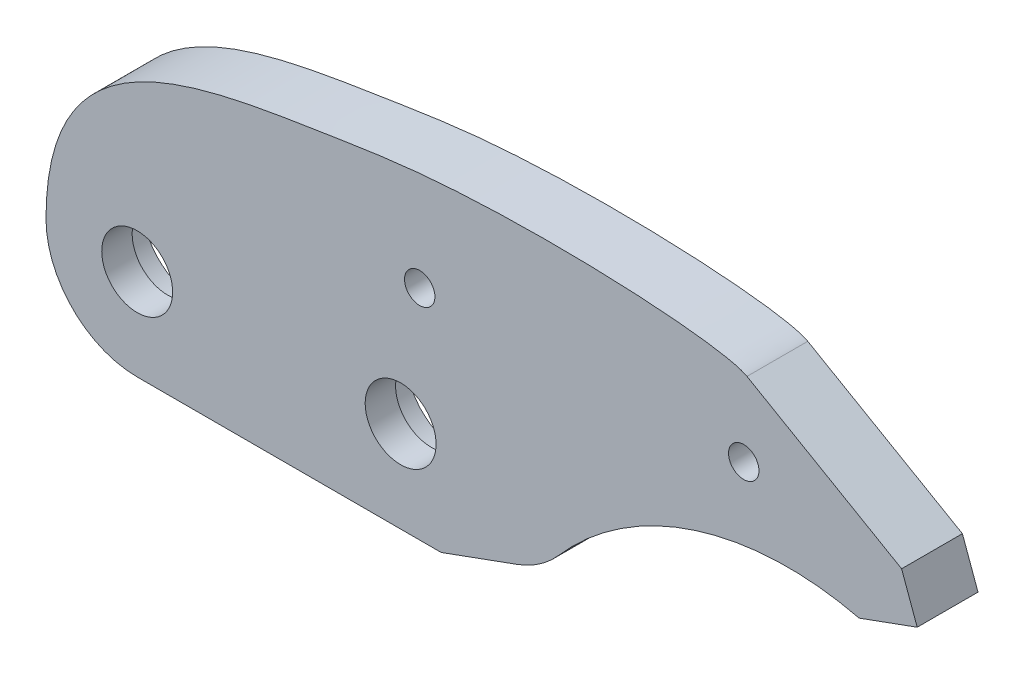
ISO-10303-21;
HEADER;
FILE_DESCRIPTION(('STEP AP214'),'2;1');
FILE_NAME('part.step','',(''),(''),'','','');
FILE_SCHEMA(('AUTOMOTIVE_DESIGN { 1 0 10303 214 1 1 1 1 }'));
ENDSEC;
DATA;
#1=APPLICATION_CONTEXT('core data for automotive mechanical design processes');
#2=APPLICATION_PROTOCOL_DEFINITION('international standard','automotive_design',2000,#1);
#3=PRODUCT_CONTEXT('',#1,'mechanical');
#4=PRODUCT('Part','Part','',(#3));
#5=PRODUCT_RELATED_PRODUCT_CATEGORY('part','',(#4));
#6=PRODUCT_DEFINITION_FORMATION('','',#4);
#7=PRODUCT_DEFINITION_CONTEXT('part definition',#1,'design');
#8=PRODUCT_DEFINITION('design','',#6,#7);
#9=PRODUCT_DEFINITION_SHAPE('','',#8);
#10=(LENGTH_UNIT() NAMED_UNIT(*) SI_UNIT(.MILLI.,.METRE.));
#11=(NAMED_UNIT(*) PLANE_ANGLE_UNIT() SI_UNIT($,.RADIAN.));
#12=(NAMED_UNIT(*) SI_UNIT($,.STERADIAN.) SOLID_ANGLE_UNIT());
#13=UNCERTAINTY_MEASURE_WITH_UNIT(LENGTH_MEASURE(1.E-05),#10,'distance_accuracy_value','');
#14=(GEOMETRIC_REPRESENTATION_CONTEXT(3) GLOBAL_UNCERTAINTY_ASSIGNED_CONTEXT((#13)) GLOBAL_UNIT_ASSIGNED_CONTEXT((#10,
#11,#12)) REPRESENTATION_CONTEXT('',''));
#15=CARTESIAN_POINT('',(0.,0.,0.));
#16=DIRECTION('',(0.,0.,1.));
#17=DIRECTION('',(1.,0.,0.));
#18=AXIS2_PLACEMENT_3D('',#15,#16,#17);
#19=CARTESIAN_POINT('',(0.,0.,6.));
#20=DIRECTION('',(0.,0.,-1.));
#21=DIRECTION('',(-1.,0.,0.));
#22=AXIS2_PLACEMENT_3D('',#19,#20,#21);
#23=CYLINDRICAL_SURFACE('',#22,3.5);
#24=CARTESIAN_POINT('',(0.,0.,6.));
#25=DIRECTION('',(0.,0.,1.));
#26=DIRECTION('',(1.,0.,0.));
#27=AXIS2_PLACEMENT_3D('',#24,#25,#26);
#28=CIRCLE('',#27,3.5);
#29=CARTESIAN_POINT('',(-3.5,0.,6.));
#30=VERTEX_POINT('',#29);
#31=EDGE_CURVE('E266',#30,#30,#28,.T.);
#32=CARTESIAN_POINT('',(0.,0.,3.));
#33=DIRECTION('',(0.,0.,-1.));
#34=DIRECTION('',(-1.,0.,0.));
#35=AXIS2_PLACEMENT_3D('',#32,#33,#34);
#36=CIRCLE('',#35,3.5);
#37=CARTESIAN_POINT('',(-3.5,0.,3.));
#38=VERTEX_POINT('',#37);
#39=EDGE_CURVE('E42',#38,#38,#36,.T.);
#40=CARTESIAN_POINT('',(-3.5,0.,6.));
#41=CARTESIAN_POINT('',(-3.5,0.,5.96875));
#42=CARTESIAN_POINT('',(-3.5,0.,5.9375));
#43=CARTESIAN_POINT('',(-3.5,0.,5.875));
#44=CARTESIAN_POINT('',(-3.5,0.,5.84375));
#45=CARTESIAN_POINT('',(-3.5,0.,5.78125));
#46=CARTESIAN_POINT('',(-3.5,0.,5.75));
#47=CARTESIAN_POINT('',(-3.5,0.,5.6875));
#48=CARTESIAN_POINT('',(-3.5,0.,5.65625));
#49=CARTESIAN_POINT('',(-3.5,0.,5.59375));
#50=CARTESIAN_POINT('',(-3.5,0.,5.5625));
#51=CARTESIAN_POINT('',(-3.5,0.,5.5));
#52=CARTESIAN_POINT('',(-3.5,0.,5.46875));
#53=CARTESIAN_POINT('',(-3.5,0.,5.40625));
#54=CARTESIAN_POINT('',(-3.5,0.,5.375));
#55=CARTESIAN_POINT('',(-3.5,0.,5.3125));
#56=CARTESIAN_POINT('',(-3.5,0.,5.28125));
#57=CARTESIAN_POINT('',(-3.5,0.,5.21875));
#58=CARTESIAN_POINT('',(-3.5,0.,5.1875));
#59=CARTESIAN_POINT('',(-3.5,0.,5.125));
#60=CARTESIAN_POINT('',(-3.5,0.,5.09375));
#61=CARTESIAN_POINT('',(-3.5,0.,5.03125));
#62=CARTESIAN_POINT('',(-3.5,0.,5.));
#63=CARTESIAN_POINT('',(-3.5,0.,4.9375));
#64=CARTESIAN_POINT('',(-3.5,0.,4.90625));
#65=CARTESIAN_POINT('',(-3.5,0.,4.84375));
#66=CARTESIAN_POINT('',(-3.5,0.,4.8125));
#67=CARTESIAN_POINT('',(-3.5,0.,4.75));
#68=CARTESIAN_POINT('',(-3.5,0.,4.71875));
#69=CARTESIAN_POINT('',(-3.5,0.,4.65625));
#70=CARTESIAN_POINT('',(-3.5,0.,4.625));
#71=CARTESIAN_POINT('',(-3.5,0.,4.5625));
#72=CARTESIAN_POINT('',(-3.5,0.,4.53125));
#73=CARTESIAN_POINT('',(-3.5,0.,4.46875));
#74=CARTESIAN_POINT('',(-3.5,0.,4.4375));
#75=CARTESIAN_POINT('',(-3.5,0.,4.375));
#76=CARTESIAN_POINT('',(-3.5,0.,4.34375));
#77=CARTESIAN_POINT('',(-3.5,0.,4.28125));
#78=CARTESIAN_POINT('',(-3.5,0.,4.25));
#79=CARTESIAN_POINT('',(-3.5,0.,4.1875));
#80=CARTESIAN_POINT('',(-3.5,0.,4.15625));
#81=CARTESIAN_POINT('',(-3.5,0.,4.09375));
#82=CARTESIAN_POINT('',(-3.5,0.,4.0625));
#83=CARTESIAN_POINT('',(-3.5,0.,4.));
#84=CARTESIAN_POINT('',(-3.5,0.,3.96875));
#85=CARTESIAN_POINT('',(-3.5,0.,3.90625));
#86=CARTESIAN_POINT('',(-3.5,0.,3.875));
#87=CARTESIAN_POINT('',(-3.5,0.,3.8125));
#88=CARTESIAN_POINT('',(-3.5,0.,3.78125));
#89=CARTESIAN_POINT('',(-3.5,0.,3.71875));
#90=CARTESIAN_POINT('',(-3.5,0.,3.6875));
#91=CARTESIAN_POINT('',(-3.5,0.,3.625));
#92=CARTESIAN_POINT('',(-3.5,0.,3.59375));
#93=CARTESIAN_POINT('',(-3.5,0.,3.53125));
#94=CARTESIAN_POINT('',(-3.5,0.,3.5));
#95=CARTESIAN_POINT('',(-3.5,0.,3.4375));
#96=CARTESIAN_POINT('',(-3.5,0.,3.40625));
#97=CARTESIAN_POINT('',(-3.5,0.,3.34375));
#98=CARTESIAN_POINT('',(-3.5,0.,3.3125));
#99=CARTESIAN_POINT('',(-3.5,0.,3.25));
#100=CARTESIAN_POINT('',(-3.5,0.,3.21875));
#101=CARTESIAN_POINT('',(-3.5,0.,3.15625));
#102=CARTESIAN_POINT('',(-3.5,0.,3.125));
#103=CARTESIAN_POINT('',(-3.5,0.,3.0625));
#104=CARTESIAN_POINT('',(-3.5,0.,3.03125));
#105=CARTESIAN_POINT('',(-3.5,0.,3.));
#106=B_SPLINE_CURVE_WITH_KNOTS('',3,(#40,#41,#42,#43,#44,#45,#46,#47,#48,#49,#50,#51,#52,#53,
#54,#55,#56,#57,#58,#59,#60,#61,#62,#63,#64,#65,#66,#67,#68,#69,#70,#71,#72,#73,#74,#75,#76,#77,
#78,#79,#80,#81,#82,#83,#84,#85,#86,#87,#88,#89,#90,#91,#92,#93,#94,#95,#96,#97,#98,#99,#100,
#101,#102,#103,#104,#105),.UNSPECIFIED.,.F.,.F.,(4,2,2,2,2,2,2,2,2,2,2,2,2,2,2,2,2,2,2,2,2,2,2,
2,2,2,2,2,2,2,2,2,4),(0.,0.0937499999999992,0.187499999999999,0.281249999999999,
0.374999999999999,0.46875,0.5625,0.65625,0.75,0.84375,0.9375,1.03125,1.125,1.21875,1.3125,
1.40625,1.5,1.59375,1.6875,1.78125,1.875,1.96875,2.0625,2.15625,2.25,2.34375,2.4375,2.53125,
2.625,2.71875,2.8125,2.90625,3.),.UNSPECIFIED.);
#107=EDGE_CURVE('BSEAM38',#30,#38,#106,.T.);
#108=ORIENTED_EDGE('',*,*,#31,.T.);
#109=ORIENTED_EDGE('',*,*,#39,.T.);
#110=ORIENTED_EDGE('',*,*,#107,.T.);
#111=ORIENTED_EDGE('',*,*,#107,.F.);
#112=EDGE_LOOP('',(#108,#110,#109,#111));
#113=FACE_BOUND('',#112,.T.);
#114=ADVANCED_FACE('F38',(#113),#23,.F.);
#115=CARTESIAN_POINT('',(26.,0.,6.));
#116=DIRECTION('',(0.,0.,-1.));
#117=DIRECTION('',(-1.,0.,0.));
#118=AXIS2_PLACEMENT_3D('',#115,#116,#117);
#119=CYLINDRICAL_SURFACE('',#118,3.5);
#120=CARTESIAN_POINT('',(26.,0.,6.));
#121=DIRECTION('',(0.,0.,1.));
#122=DIRECTION('',(1.,0.,0.));
#123=AXIS2_PLACEMENT_3D('',#120,#121,#122);
#124=CIRCLE('',#123,3.5);
#125=CARTESIAN_POINT('',(22.5,0.,6.));
#126=VERTEX_POINT('',#125);
#127=EDGE_CURVE('E143',#126,#126,#124,.T.);
#128=CARTESIAN_POINT('',(26.,0.,3.));
#129=DIRECTION('',(0.,0.,-1.));
#130=DIRECTION('',(-1.,0.,0.));
#131=AXIS2_PLACEMENT_3D('',#128,#129,#130);
#132=CIRCLE('',#131,3.5);
#133=CARTESIAN_POINT('',(22.5,0.,3.));
#134=VERTEX_POINT('',#133);
#135=EDGE_CURVE('E164',#134,#134,#132,.T.);
#136=CARTESIAN_POINT('',(22.5,0.,6.));
#137=CARTESIAN_POINT('',(22.5,0.,5.96875));
#138=CARTESIAN_POINT('',(22.5,0.,5.9375));
#139=CARTESIAN_POINT('',(22.5,0.,5.875));
#140=CARTESIAN_POINT('',(22.5,0.,5.84375));
#141=CARTESIAN_POINT('',(22.5,0.,5.78125));
#142=CARTESIAN_POINT('',(22.5,0.,5.75));
#143=CARTESIAN_POINT('',(22.5,0.,5.6875));
#144=CARTESIAN_POINT('',(22.5,0.,5.65625));
#145=CARTESIAN_POINT('',(22.5,0.,5.59375));
#146=CARTESIAN_POINT('',(22.5,0.,5.5625));
#147=CARTESIAN_POINT('',(22.5,0.,5.5));
#148=CARTESIAN_POINT('',(22.5,0.,5.46875));
#149=CARTESIAN_POINT('',(22.5,0.,5.40625));
#150=CARTESIAN_POINT('',(22.5,0.,5.375));
#151=CARTESIAN_POINT('',(22.5,0.,5.3125));
#152=CARTESIAN_POINT('',(22.5,0.,5.28125));
#153=CARTESIAN_POINT('',(22.5,0.,5.21875));
#154=CARTESIAN_POINT('',(22.5,0.,5.1875));
#155=CARTESIAN_POINT('',(22.5,0.,5.125));
#156=CARTESIAN_POINT('',(22.5,0.,5.09375));
#157=CARTESIAN_POINT('',(22.5,0.,5.03125));
#158=CARTESIAN_POINT('',(22.5,0.,5.));
#159=CARTESIAN_POINT('',(22.5,0.,4.9375));
#160=CARTESIAN_POINT('',(22.5,0.,4.90625));
#161=CARTESIAN_POINT('',(22.5,0.,4.84375));
#162=CARTESIAN_POINT('',(22.5,0.,4.8125));
#163=CARTESIAN_POINT('',(22.5,0.,4.75));
#164=CARTESIAN_POINT('',(22.5,0.,4.71875));
#165=CARTESIAN_POINT('',(22.5,0.,4.65625));
#166=CARTESIAN_POINT('',(22.5,0.,4.625));
#167=CARTESIAN_POINT('',(22.5,0.,4.5625));
#168=CARTESIAN_POINT('',(22.5,0.,4.53125));
#169=CARTESIAN_POINT('',(22.5,0.,4.46875));
#170=CARTESIAN_POINT('',(22.5,0.,4.4375));
#171=CARTESIAN_POINT('',(22.5,0.,4.375));
#172=CARTESIAN_POINT('',(22.5,0.,4.34375));
#173=CARTESIAN_POINT('',(22.5,0.,4.28125));
#174=CARTESIAN_POINT('',(22.5,0.,4.25));
#175=CARTESIAN_POINT('',(22.5,0.,4.1875));
#176=CARTESIAN_POINT('',(22.5,0.,4.15625));
#177=CARTESIAN_POINT('',(22.5,0.,4.09375));
#178=CARTESIAN_POINT('',(22.5,0.,4.0625));
#179=CARTESIAN_POINT('',(22.5,0.,4.));
#180=CARTESIAN_POINT('',(22.5,0.,3.96875));
#181=CARTESIAN_POINT('',(22.5,0.,3.90625));
#182=CARTESIAN_POINT('',(22.5,0.,3.875));
#183=CARTESIAN_POINT('',(22.5,0.,3.8125));
#184=CARTESIAN_POINT('',(22.5,0.,3.78125));
#185=CARTESIAN_POINT('',(22.5,0.,3.71875));
#186=CARTESIAN_POINT('',(22.5,0.,3.6875));
#187=CARTESIAN_POINT('',(22.5,0.,3.625));
#188=CARTESIAN_POINT('',(22.5,0.,3.59375));
#189=CARTESIAN_POINT('',(22.5,0.,3.53125));
#190=CARTESIAN_POINT('',(22.5,0.,3.5));
#191=CARTESIAN_POINT('',(22.5,0.,3.4375));
#192=CARTESIAN_POINT('',(22.5,0.,3.40625));
#193=CARTESIAN_POINT('',(22.5,0.,3.34375));
#194=CARTESIAN_POINT('',(22.5,0.,3.3125));
#195=CARTESIAN_POINT('',(22.5,0.,3.25));
#196=CARTESIAN_POINT('',(22.5,0.,3.21875));
#197=CARTESIAN_POINT('',(22.5,0.,3.15625));
#198=CARTESIAN_POINT('',(22.5,0.,3.125));
#199=CARTESIAN_POINT('',(22.5,0.,3.0625));
#200=CARTESIAN_POINT('',(22.5,0.,3.03125));
#201=CARTESIAN_POINT('',(22.5,0.,3.));
#202=B_SPLINE_CURVE_WITH_KNOTS('',3,(#136,#137,#138,#139,#140,#141,#142,#143,#144,#145,#146,
#147,#148,#149,#150,#151,#152,#153,#154,#155,#156,#157,#158,#159,#160,#161,#162,#163,#164,#165,
#166,#167,#168,#169,#170,#171,#172,#173,#174,#175,#176,#177,#178,#179,#180,#181,#182,#183,#184,
#185,#186,#187,#188,#189,#190,#191,#192,#193,#194,#195,#196,#197,#198,#199,#200,#201),
.UNSPECIFIED.,.F.,.F.,(4,2,2,2,2,2,2,2,2,2,2,2,2,2,2,2,2,2,2,2,2,2,2,2,2,2,2,2,2,2,2,2,4),(0.,
0.0937499999999992,0.187499999999999,0.281249999999999,0.374999999999999,0.46875,0.5625,0.65625,
0.75,0.84375,0.9375,1.03125,1.125,1.21875,1.3125,1.40625,1.5,1.59375,1.6875,1.78125,1.875,
1.96875,2.0625,2.15625,2.25,2.34375,2.4375,2.53125,2.625,2.71875,2.8125,2.90625,3.),.UNSPECIFIED.);
#203=EDGE_CURVE('BSEAM256',#126,#134,#202,.T.);
#204=ORIENTED_EDGE('',*,*,#127,.T.);
#205=ORIENTED_EDGE('',*,*,#135,.T.);
#206=ORIENTED_EDGE('',*,*,#203,.T.);
#207=ORIENTED_EDGE('',*,*,#203,.F.);
#208=EDGE_LOOP('',(#204,#206,#205,#207));
#209=FACE_BOUND('',#208,.T.);
#210=ADVANCED_FACE('F256',(#209),#119,.F.);
#211=CARTESIAN_POINT('',(6.40187759680475,-17.5890141393335,6.));
#212=DIRECTION('',(-0.342020143325669,0.939692620785909,0.));
#213=DIRECTION('',(-0.939692620785909,-0.342020143325669,0.));
#214=AXIS2_PLACEMENT_3D('',#211,#212,#213);
#215=PLANE('',#214);
#216=DIRECTION('',(0.939692620785909,0.342020143325669,0.));
#217=VECTOR('',#216,1.);
#218=CARTESIAN_POINT('',(6.40187759680475,-17.5890141393335,6.));
#219=LINE('',#218,#217);
#220=CARTESIAN_POINT('',(71.2548879464198,6.01555123048434,6.));
#221=VERTEX_POINT('',#220);
#222=CARTESIAN_POINT('',(76.9846310392954,8.10100716628343,6.));
#223=VERTEX_POINT('',#222);
#224=EDGE_CURVE('E126',#221,#223,#219,.T.);
#225=ORIENTED_EDGE('',*,*,#224,.F.);
#226=DIRECTION('',(0.,0.,-1.));
#227=VECTOR('',#226,1.);
#228=CARTESIAN_POINT('',(71.2548879464198,6.01555123048434,10.));
#229=LINE('',#228,#227);
#230=CARTESIAN_POINT('',(71.2548879464198,6.01555123048433,0.));
#231=VERTEX_POINT('',#230);
#232=EDGE_CURVE('E111',#221,#231,#229,.T.);
#233=ORIENTED_EDGE('',*,*,#232,.T.);
#234=DIRECTION('',(0.939692620785909,0.342020143325669,0.));
#235=VECTOR('',#234,1.);
#236=CARTESIAN_POINT('',(6.40187759680475,-17.5890141393335,0.));
#237=LINE('',#236,#235);
#238=CARTESIAN_POINT('',(76.9846310392954,8.10100716628343,0.));
#239=VERTEX_POINT('',#238);
#240=EDGE_CURVE('E124',#231,#239,#237,.T.);
#241=ORIENTED_EDGE('',*,*,#240,.T.);
#242=DIRECTION('',(0.,0.,-1.));
#243=VECTOR('',#242,1.);
#244=CARTESIAN_POINT('',(76.9846310392954,8.10100716628343,6.));
#245=LINE('',#244,#243);
#246=EDGE_CURVE('E151',#223,#239,#245,.T.);
#247=ORIENTED_EDGE('',*,*,#246,.F.);
#248=EDGE_LOOP('',(#225,#233,#241,#247));
#249=FACE_BOUND('',#248,.T.);
#250=ADVANCED_FACE('F122',(#249),#215,.F.);
#251=CARTESIAN_POINT('',(0.,0.,6.));
#252=DIRECTION('',(0.,0.,-1.));
#253=DIRECTION('',(-1.,0.,0.));
#254=AXIS2_PLACEMENT_3D('',#251,#252,#253);
#255=CYLINDRICAL_SURFACE('',#254,9.);
#256=CARTESIAN_POINT('',(0.,0.,6.));
#257=DIRECTION('',(0.,0.,1.));
#258=DIRECTION('',(1.,0.,0.));
#259=AXIS2_PLACEMENT_3D('',#256,#257,#258);
#260=CIRCLE('',#259,9.);
#261=CARTESIAN_POINT('',(-9.,0.,6.));
#262=VERTEX_POINT('',#261);
#263=CARTESIAN_POINT('',(0.,-9.,6.));
#264=VERTEX_POINT('',#263);
#265=EDGE_CURVE('E55',#262,#264,#260,.T.);
#266=ORIENTED_EDGE('',*,*,#265,.F.);
#267=DIRECTION('',(0.,0.,-1.));
#268=VECTOR('',#267,1.);
#269=CARTESIAN_POINT('',(-9.,0.,79.1754629659332));
#270=LINE('',#269,#268);
#271=CARTESIAN_POINT('',(-9.,0.,0.));
#272=VERTEX_POINT('',#271);
#273=EDGE_CURVE('E59',#262,#272,#270,.T.);
#274=ORIENTED_EDGE('',*,*,#273,.T.);
#275=CARTESIAN_POINT('',(0.,0.,0.));
#276=DIRECTION('',(0.,0.,1.));
#277=DIRECTION('',(1.,0.,0.));
#278=AXIS2_PLACEMENT_3D('',#275,#276,#277);
#279=CIRCLE('',#278,9.);
#280=CARTESIAN_POINT('',(0.,-9.,0.));
#281=VERTEX_POINT('',#280);
#282=EDGE_CURVE('E127',#272,#281,#279,.T.);
#283=ORIENTED_EDGE('',*,*,#282,.T.);
#284=DIRECTION('',(0.,0.,-1.));
#285=VECTOR('',#284,1.);
#286=CARTESIAN_POINT('',(0.,-9.,6.));
#287=LINE('',#286,#285);
#288=EDGE_CURVE('E156',#264,#281,#287,.T.);
#289=ORIENTED_EDGE('',*,*,#288,.F.);
#290=EDGE_LOOP('',(#266,#274,#283,#289));
#291=FACE_BOUND('',#290,.T.);
#292=ADVANCED_FACE('F251',(#291),#255,.T.);
#293=CARTESIAN_POINT('',(0.,-9.,6.));
#294=DIRECTION('',(0.,1.,0.));
#295=DIRECTION('',(0.,0.,1.));
#296=AXIS2_PLACEMENT_3D('',#293,#294,#295);
#297=PLANE('',#296);
#298=DIRECTION('',(1.,0.,0.));
#299=VECTOR('',#298,1.);
#300=CARTESIAN_POINT('',(0.,-9.,0.));
#301=LINE('',#300,#299);
#302=CARTESIAN_POINT('',(30.,-9.,0.));
#303=VERTEX_POINT('',#302);
#304=EDGE_CURVE('E134',#281,#303,#301,.T.);
#305=ORIENTED_EDGE('',*,*,#304,.T.);
#306=DIRECTION('',(0.,0.,-1.));
#307=VECTOR('',#306,1.);
#308=CARTESIAN_POINT('',(30.,-9.,6.));
#309=LINE('',#308,#307);
#310=CARTESIAN_POINT('',(30.,-9.,6.));
#311=VERTEX_POINT('',#310);
#312=EDGE_CURVE('E153',#311,#303,#309,.T.);
#313=ORIENTED_EDGE('',*,*,#312,.F.);
#314=DIRECTION('',(1.,0.,0.));
#315=VECTOR('',#314,1.);
#316=CARTESIAN_POINT('',(0.,-9.,6.));
#317=LINE('',#316,#315);
#318=EDGE_CURVE('E272',#264,#311,#317,.T.);
#319=ORIENTED_EDGE('',*,*,#318,.F.);
#320=ORIENTED_EDGE('',*,*,#288,.T.);
#321=EDGE_LOOP('',(#305,#313,#319,#320));
#322=FACE_BOUND('',#321,.T.);
#323=ADVANCED_FACE('F247',(#322),#297,.F.);
#324=CARTESIAN_POINT('',(37.4747793850678,-6.27940279612869,0.));
#325=VERTEX_POINT('',#324);
#326=EDGE_CURVE('E133',#303,#325,#237,.T.);
#327=ORIENTED_EDGE('',*,*,#326,.T.);
#328=DIRECTION('',(0.,0.,-1.));
#329=VECTOR('',#328,1.);
#330=CARTESIAN_POINT('',(37.4747793850678,-6.27940279612869,6.));
#331=LINE('',#330,#329);
#332=CARTESIAN_POINT('',(37.4747793850678,-6.27940279612869,6.));
#333=VERTEX_POINT('',#332);
#334=EDGE_CURVE('E159',#325,#333,#331,.F.);
#335=ORIENTED_EDGE('',*,*,#334,.T.);
#336=EDGE_CURVE('E274',#311,#333,#219,.T.);
#337=ORIENTED_EDGE('',*,*,#336,.F.);
#338=ORIENTED_EDGE('',*,*,#312,.T.);
#339=EDGE_LOOP('',(#327,#335,#337,#338));
#340=FACE_BOUND('',#339,.T.);
#341=ADVANCED_FACE('F243',(#340),#215,.F.);
#342=CARTESIAN_POINT('',(70.5827534424907,25.6900213056169,6.));
#343=DIRECTION('',(-0.939692620785909,-0.342020143325668,0.));
#344=DIRECTION('',(0.342020143325668,-0.939692620785909,0.));
#345=AXIS2_PLACEMENT_3D('',#342,#343,#344);
#346=PLANE('',#345);
#347=DIRECTION('',(-0.342020143325668,0.939692620785909,0.));
#348=VECTOR('',#347,1.);
#349=CARTESIAN_POINT('',(70.5827534424907,25.6900213056169,0.));
#350=LINE('',#349,#348);
#351=CARTESIAN_POINT('',(75.4455403943299,12.32962395982,0.));
#352=VERTEX_POINT('',#351);
#353=EDGE_CURVE('E132',#239,#352,#350,.T.);
#354=ORIENTED_EDGE('',*,*,#353,.T.);
#355=DIRECTION('',(0.,0.,-1.));
#356=VECTOR('',#355,1.);
#357=CARTESIAN_POINT('',(75.4455403943299,12.32962395982,6.));
#358=LINE('',#357,#356);
#359=CARTESIAN_POINT('',(75.4455403943299,12.32962395982,6.));
#360=VERTEX_POINT('',#359);
#361=EDGE_CURVE('E147',#360,#352,#358,.T.);
#362=ORIENTED_EDGE('',*,*,#361,.F.);
#363=DIRECTION('',(-0.342020143325668,0.939692620785909,0.));
#364=VECTOR('',#363,1.);
#365=CARTESIAN_POINT('',(70.5827534424907,25.6900213056169,6.));
#366=LINE('',#365,#364);
#367=EDGE_CURVE('E277',#223,#360,#366,.T.);
#368=ORIENTED_EDGE('',*,*,#367,.F.);
#369=ORIENTED_EDGE('',*,*,#246,.T.);
#370=EDGE_LOOP('',(#354,#362,#368,#369));
#371=FACE_BOUND('',#370,.T.);
#372=ADVANCED_FACE('F239',(#371),#346,.F.);
#373=CARTESIAN_POINT('',(24.200268882739,41.9160952617323,6.));
#374=DIRECTION('',(-0.499999999999998,-0.86602540378444,0.));
#375=DIRECTION('',(0.86602540378444,-0.499999999999998,0.));
#376=AXIS2_PLACEMENT_3D('',#373,#374,#375);
#377=PLANE('',#376);
#378=DIRECTION('',(-0.86602540378444,0.499999999999998,0.));
#379=VECTOR('',#378,1.);
#380=CARTESIAN_POINT('',(24.200268882739,41.9160952617323,0.));
#381=LINE('',#380,#379);
#382=CARTESIAN_POINT('',(60.1835760838935,21.1411231628129,0.));
#383=VERTEX_POINT('',#382);
#384=EDGE_CURVE('E141',#352,#383,#381,.T.);
#385=ORIENTED_EDGE('',*,*,#384,.T.);
#386=DIRECTION('',(0.,0.,-1.));
#387=VECTOR('',#386,1.);
#388=CARTESIAN_POINT('',(60.1835760838935,21.1411231628129,6.));
#389=LINE('',#388,#387);
#390=CARTESIAN_POINT('',(60.1835760838935,21.1411231628129,6.));
#391=VERTEX_POINT('',#390);
#392=EDGE_CURVE('E144',#391,#383,#389,.T.);
#393=ORIENTED_EDGE('',*,*,#392,.F.);
#394=DIRECTION('',(-0.86602540378444,0.499999999999998,0.));
#395=VECTOR('',#394,1.);
#396=CARTESIAN_POINT('',(24.200268882739,41.9160952617323,6.));
#397=LINE('',#396,#395);
#398=EDGE_CURVE('E148',#360,#391,#397,.T.);
#399=ORIENTED_EDGE('',*,*,#398,.F.);
#400=ORIENTED_EDGE('',*,*,#361,.T.);
#401=EDGE_LOOP('',(#385,#393,#399,#400));
#402=FACE_BOUND('',#401,.T.);
#403=ADVANCED_FACE('F232',(#402),#377,.F.);
#404=CARTESIAN_POINT('',(0.,0.,6.));
#405=DIRECTION('',(0.,0.,1.));
#406=DIRECTION('',(1.,0.,0.));
#407=AXIS2_PLACEMENT_3D('',#404,#405,#406);
#408=PLANE('',#407);
#409=CARTESIAN_POINT('',(59.8656137459827,13.6633130650325,6.));
#410=DIRECTION('',(0.,0.,1.));
#411=DIRECTION('',(1.,0.,0.));
#412=AXIS2_PLACEMENT_3D('',#409,#410,#411);
#413=CIRCLE('',#412,1.5);
#414=CARTESIAN_POINT('',(61.3656137459827,13.6633130650325,6.));
#415=VERTEX_POINT('',#414);
#416=EDGE_CURVE('E193',#415,#415,#413,.T.);
#417=ORIENTED_EDGE('',*,*,#416,.F.);
#418=EDGE_LOOP('',(#417));
#419=FACE_BOUND('',#418,.T.);
#420=CARTESIAN_POINT('',(27.8851072813716,12.5465291705524,6.));
#421=DIRECTION('',(0.,0.,1.));
#422=DIRECTION('',(1.,0.,0.));
#423=AXIS2_PLACEMENT_3D('',#420,#421,#422);
#424=CIRCLE('',#423,1.5);
#425=CARTESIAN_POINT('',(29.3851072813716,12.5465291705524,6.));
#426=VERTEX_POINT('',#425);
#427=EDGE_CURVE('E188',#426,#426,#424,.T.);
#428=ORIENTED_EDGE('',*,*,#427,.F.);
#429=EDGE_LOOP('',(#428));
#430=FACE_BOUND('',#429,.T.);
#431=CARTESIAN_POINT('',(60.1835760838935,21.1411231628129,6.00000000000001));
#432=CARTESIAN_POINT('',(57.5829949431317,22.6425693844812,6.00000000000001));
#433=CARTESIAN_POINT('',(35.7853664484623,23.8386488820733,6.00000000000001));
#434=CARTESIAN_POINT('',(8.37706294240831,19.4400192343514,6.00000000000001));
#435=CARTESIAN_POINT('',(-9.00000000000002,16.9140467504502,6.00000000000001));
#436=CARTESIAN_POINT('',(-9.00000000000001,0.,6.00000000000001));
#437=B_SPLINE_CURVE_WITH_KNOTS('',3,(#431,#432,#433,#434,#435,#436),.UNSPECIFIED.,.F.,.F.,(4,1,
1,4),(0.,0.435384132930644,0.535384132930644,1.),.UNSPECIFIED.);
#438=EDGE_CURVE('E118',#391,#262,#437,.T.);
#439=ORIENTED_EDGE('',*,*,#438,.T.);
#440=ORIENTED_EDGE('',*,*,#265,.T.);
#441=ORIENTED_EDGE('',*,*,#318,.T.);
#442=ORIENTED_EDGE('',*,*,#336,.T.);
#443=CARTESIAN_POINT('',(34.0545779518111,3.1175234117304,6.));
#444=DIRECTION('',(0.,0.,1.));
#445=DIRECTION('',(1.,0.,0.));
#446=AXIS2_PLACEMENT_3D('',#443,#444,#445);
#447=CIRCLE('',#446,10.);
#448=CARTESIAN_POINT('',(41.596521544483,-3.44898912118657,6.));
#449=VERTEX_POINT('',#448);
#450=EDGE_CURVE('E162',#333,#449,#447,.T.);
#451=ORIENTED_EDGE('',*,*,#450,.T.);
#452=CARTESIAN_POINT('',(64.2223523224986,-23.1485267199375,6.));
#453=DIRECTION('',(0.,0.,1.));
#454=DIRECTION('',(1.,0.,0.));
#455=AXIS2_PLACEMENT_3D('',#452,#453,#454);
#456=CIRCLE('',#455,30.);
#457=EDGE_CURVE('E117',#221,#449,#456,.T.);
#458=ORIENTED_EDGE('',*,*,#457,.F.);
#459=ORIENTED_EDGE('',*,*,#224,.T.);
#460=ORIENTED_EDGE('',*,*,#367,.T.);
#461=ORIENTED_EDGE('',*,*,#398,.T.);
#462=EDGE_LOOP('',(#439,#440,#441,#442,#451,#458,#459,#460,#461));
#463=FACE_BOUND('',#462,.T.);
#464=ORIENTED_EDGE('',*,*,#127,.F.);
#465=EDGE_LOOP('',(#464));
#466=FACE_BOUND('',#465,.T.);
#467=ORIENTED_EDGE('',*,*,#31,.F.);
#468=EDGE_LOOP('',(#467));
#469=FACE_BOUND('',#468,.T.);
#470=ADVANCED_FACE('F229',(#419,#430,#463,#466,#469),#408,.T.);
#471=CARTESIAN_POINT('',(0.,0.,0.));
#472=DIRECTION('',(0.,0.,1.));
#473=DIRECTION('',(1.,0.,0.));
#474=AXIS2_PLACEMENT_3D('',#471,#472,#473);
#475=PLANE('',#474);
#476=CARTESIAN_POINT('',(0.,0.,0.));
#477=DIRECTION('',(0.,0.,-1.));
#478=DIRECTION('',(-1.,0.,0.));
#479=AXIS2_PLACEMENT_3D('',#476,#477,#478);
#480=CIRCLE('',#479,5.5);
#481=CARTESIAN_POINT('',(-5.5,0.,0.));
#482=VERTEX_POINT('',#481);
#483=EDGE_CURVE('E172',#482,#482,#480,.T.);
#484=ORIENTED_EDGE('',*,*,#483,.F.);
#485=EDGE_LOOP('',(#484));
#486=FACE_BOUND('',#485,.T.);
#487=CARTESIAN_POINT('',(26.,0.,0.));
#488=DIRECTION('',(0.,0.,-1.));
#489=DIRECTION('',(-1.,0.,0.));
#490=AXIS2_PLACEMENT_3D('',#487,#488,#489);
#491=CIRCLE('',#490,5.5);
#492=CARTESIAN_POINT('',(20.5,0.,0.));
#493=VERTEX_POINT('',#492);
#494=EDGE_CURVE('E182',#493,#493,#491,.T.);
#495=ORIENTED_EDGE('',*,*,#494,.F.);
#496=EDGE_LOOP('',(#495));
#497=FACE_BOUND('',#496,.T.);
#498=CARTESIAN_POINT('',(59.8656137459827,13.6633130650325,0.));
#499=DIRECTION('',(0.,0.,-1.));
#500=DIRECTION('',(-1.,0.,0.));
#501=AXIS2_PLACEMENT_3D('',#498,#499,#500);
#502=CIRCLE('',#501,1.5);
#503=CARTESIAN_POINT('',(58.3656137459827,13.6633130650325,0.));
#504=VERTEX_POINT('',#503);
#505=EDGE_CURVE('E185',#504,#504,#502,.T.);
#506=ORIENTED_EDGE('',*,*,#505,.F.);
#507=EDGE_LOOP('',(#506));
#508=FACE_BOUND('',#507,.T.);
#509=CARTESIAN_POINT('',(27.8851072813716,12.5465291705524,0.));
#510=DIRECTION('',(0.,0.,-1.));
#511=DIRECTION('',(-1.,0.,0.));
#512=AXIS2_PLACEMENT_3D('',#509,#510,#511);
#513=CIRCLE('',#512,1.5);
#514=CARTESIAN_POINT('',(26.3851072813716,12.5465291705524,0.));
#515=VERTEX_POINT('',#514);
#516=EDGE_CURVE('E170',#515,#515,#513,.T.);
#517=ORIENTED_EDGE('',*,*,#516,.F.);
#518=EDGE_LOOP('',(#517));
#519=FACE_BOUND('',#518,.T.);
#520=ORIENTED_EDGE('',*,*,#282,.F.);
#521=CARTESIAN_POINT('',(60.1835760838935,21.1411231628129,0.));
#522=CARTESIAN_POINT('',(57.5829949431317,22.6425693844812,0.));
#523=CARTESIAN_POINT('',(35.7853664484623,23.8386488820733,0.));
#524=CARTESIAN_POINT('',(8.37706294240831,19.4400192343514,0.));
#525=CARTESIAN_POINT('',(-9.00000000000002,16.9140467504502,0.));
#526=CARTESIAN_POINT('',(-9.00000000000001,0.,0.));
#527=B_SPLINE_CURVE_WITH_KNOTS('',3,(#521,#522,#523,#524,#525,#526),.UNSPECIFIED.,.F.,.F.,(4,1,
1,4),(0.,0.435384132930644,0.535384132930644,1.),.UNSPECIFIED.);
#528=EDGE_CURVE('E196',#383,#272,#527,.T.);
#529=ORIENTED_EDGE('',*,*,#528,.F.);
#530=ORIENTED_EDGE('',*,*,#384,.F.);
#531=ORIENTED_EDGE('',*,*,#353,.F.);
#532=ORIENTED_EDGE('',*,*,#240,.F.);
#533=CARTESIAN_POINT('',(64.2223523224986,-23.1485267199375,0.));
#534=DIRECTION('',(0.,0.,-1.));
#535=DIRECTION('',(-1.,0.,0.));
#536=AXIS2_PLACEMENT_3D('',#533,#534,#535);
#537=CIRCLE('',#536,30.);
#538=CARTESIAN_POINT('',(41.596521544483,-3.44898912118657,0.));
#539=VERTEX_POINT('',#538);
#540=EDGE_CURVE('E107',#539,#231,#537,.T.);
#541=ORIENTED_EDGE('',*,*,#540,.F.);
#542=CARTESIAN_POINT('',(34.0545779518111,3.1175234117304,0.));
#543=DIRECTION('',(0.,0.,1.));
#544=DIRECTION('',(1.,0.,0.));
#545=AXIS2_PLACEMENT_3D('',#542,#543,#544);
#546=CIRCLE('',#545,10.);
#547=EDGE_CURVE('E11',#539,#325,#546,.F.);
#548=ORIENTED_EDGE('',*,*,#547,.T.);
#549=ORIENTED_EDGE('',*,*,#326,.F.);
#550=ORIENTED_EDGE('',*,*,#304,.F.);
#551=EDGE_LOOP('',(#520,#529,#530,#531,#532,#541,#548,#549,#550));
#552=FACE_BOUND('',#551,.T.);
#553=ADVANCED_FACE('F130',(#486,#497,#508,#519,#552),#475,.F.);
#554=CARTESIAN_POINT('',(64.2223523224986,-23.1485267199375,10.));
#555=DIRECTION('',(0.,0.,-1.));
#556=DIRECTION('',(-1.,0.,0.));
#557=AXIS2_PLACEMENT_3D('',#554,#555,#556);
#558=CYLINDRICAL_SURFACE('',#557,30.);
#559=ORIENTED_EDGE('',*,*,#457,.T.);
#560=DIRECTION('',(0.,0.,-1.));
#561=VECTOR('',#560,1.);
#562=CARTESIAN_POINT('',(41.596521544483,-3.44898912118656,10.));
#563=LINE('',#562,#561);
#564=EDGE_CURVE('E47',#449,#539,#563,.T.);
#565=ORIENTED_EDGE('',*,*,#564,.T.);
#566=ORIENTED_EDGE('',*,*,#540,.T.);
#567=ORIENTED_EDGE('',*,*,#232,.F.);
#568=EDGE_LOOP('',(#559,#565,#566,#567));
#569=FACE_BOUND('',#568,.T.);
#570=ADVANCED_FACE('F110',(#569),#558,.F.);
#571=CARTESIAN_POINT('',(34.0545779518111,3.1175234117304,10.));
#572=DIRECTION('',(0.,0.,-1.));
#573=DIRECTION('',(-1.,0.,0.));
#574=AXIS2_PLACEMENT_3D('',#571,#572,#573);
#575=CYLINDRICAL_SURFACE('',#574,10.);
#576=ORIENTED_EDGE('',*,*,#547,.F.);
#577=ORIENTED_EDGE('',*,*,#564,.F.);
#578=ORIENTED_EDGE('',*,*,#450,.F.);
#579=ORIENTED_EDGE('',*,*,#334,.F.);
#580=EDGE_LOOP('',(#576,#577,#578,#579));
#581=FACE_BOUND('',#580,.T.);
#582=ADVANCED_FACE('F40',(#581),#575,.T.);
#583=CARTESIAN_POINT('',(60.1835760838935,21.1411231628129,79.1754629659332));
#584=CARTESIAN_POINT('',(57.5829949431317,22.6425693844812,79.1754629659332));
#585=CARTESIAN_POINT('',(35.7853664484623,23.8386488820733,79.1754629659332));
#586=CARTESIAN_POINT('',(8.37706294240831,19.4400192343514,79.1754629659332));
#587=CARTESIAN_POINT('',(-9.00000000000002,16.9140467504502,79.1754629659332));
#588=CARTESIAN_POINT('',(-9.00000000000001,0.,79.1754629659332));
#589=B_SPLINE_CURVE_WITH_KNOTS('',3,(#583,#584,#585,#586,#587,#588),.UNSPECIFIED.,.F.,.F.,(4,1,
1,4),(0.,0.435384132930644,0.535384132930644,1.),.UNSPECIFIED.);
#590=DIRECTION('',(0.,0.,-1.));
#591=VECTOR('',#590,1.);
#592=SURFACE_OF_LINEAR_EXTRUSION('',#589,#591);
#593=ORIENTED_EDGE('',*,*,#438,.F.);
#594=ORIENTED_EDGE('',*,*,#392,.T.);
#595=ORIENTED_EDGE('',*,*,#528,.T.);
#596=ORIENTED_EDGE('',*,*,#273,.F.);
#597=EDGE_LOOP('',(#593,#594,#595,#596));
#598=FACE_BOUND('',#597,.T.);
#599=ADVANCED_FACE('F220',(#598),#592,.F.);
#600=CARTESIAN_POINT('',(27.8851072813716,12.5465291705524,14.));
#601=DIRECTION('',(0.,0.,-1.));
#602=DIRECTION('',(-1.,0.,0.));
#603=AXIS2_PLACEMENT_3D('',#600,#601,#602);
#604=CYLINDRICAL_SURFACE('',#603,1.5);
#605=ORIENTED_EDGE('',*,*,#427,.T.);
#606=EDGE_LOOP('',(#605));
#607=FACE_BOUND('',#606,.T.);
#608=ORIENTED_EDGE('',*,*,#516,.T.);
#609=EDGE_LOOP('',(#608));
#610=FACE_BOUND('',#609,.T.);
#611=ADVANCED_FACE('F224',(#607,#610),#604,.F.);
#612=CARTESIAN_POINT('',(59.8656137459827,13.6633130650325,14.));
#613=DIRECTION('',(0.,0.,-1.));
#614=DIRECTION('',(-1.,0.,0.));
#615=AXIS2_PLACEMENT_3D('',#612,#613,#614);
#616=CYLINDRICAL_SURFACE('',#615,1.5);
#617=ORIENTED_EDGE('',*,*,#416,.T.);
#618=EDGE_LOOP('',(#617));
#619=FACE_BOUND('',#618,.T.);
#620=ORIENTED_EDGE('',*,*,#505,.T.);
#621=EDGE_LOOP('',(#620));
#622=FACE_BOUND('',#621,.T.);
#623=ADVANCED_FACE('F314',(#619,#622),#616,.F.);
#624=CARTESIAN_POINT('',(26.,0.,3.));
#625=DIRECTION('',(0.,0.,-1.));
#626=DIRECTION('',(-1.,0.,0.));
#627=AXIS2_PLACEMENT_3D('',#624,#625,#626);
#628=CYLINDRICAL_SURFACE('',#627,5.5);
#629=CARTESIAN_POINT('',(26.,0.,3.));
#630=DIRECTION('',(0.,0.,-1.));
#631=DIRECTION('',(-1.,0.,0.));
#632=AXIS2_PLACEMENT_3D('',#629,#630,#631);
#633=CIRCLE('',#632,5.5);
#634=CARTESIAN_POINT('',(20.5,0.,3.));
#635=VERTEX_POINT('',#634);
#636=EDGE_CURVE('E177',#635,#635,#633,.T.);
#637=ORIENTED_EDGE('',*,*,#636,.F.);
#638=EDGE_LOOP('',(#637));
#639=FACE_BOUND('',#638,.T.);
#640=ORIENTED_EDGE('',*,*,#494,.T.);
#641=EDGE_LOOP('',(#640));
#642=FACE_BOUND('',#641,.T.);
#643=ADVANCED_FACE('F311',(#639,#642),#628,.F.);
#644=CARTESIAN_POINT('',(26.,0.,3.));
#645=DIRECTION('',(0.,0.,-1.));
#646=DIRECTION('',(-1.,0.,0.));
#647=AXIS2_PLACEMENT_3D('',#644,#645,#646);
#648=PLANE('',#647);
#649=ORIENTED_EDGE('',*,*,#135,.F.);
#650=EDGE_LOOP('',(#649));
#651=FACE_BOUND('',#650,.T.);
#652=ORIENTED_EDGE('',*,*,#636,.T.);
#653=EDGE_LOOP('',(#652));
#654=FACE_BOUND('',#653,.T.);
#655=ADVANCED_FACE('F305',(#651,#654),#648,.T.);
#656=CARTESIAN_POINT('',(0.,0.,3.));
#657=DIRECTION('',(0.,0.,-1.));
#658=DIRECTION('',(-1.,0.,0.));
#659=AXIS2_PLACEMENT_3D('',#656,#657,#658);
#660=CYLINDRICAL_SURFACE('',#659,5.5);
#661=CARTESIAN_POINT('',(0.,0.,3.));
#662=DIRECTION('',(0.,0.,-1.));
#663=DIRECTION('',(-1.,0.,0.));
#664=AXIS2_PLACEMENT_3D('',#661,#662,#663);
#665=CIRCLE('',#664,5.5);
#666=CARTESIAN_POINT('',(-5.5,0.,3.));
#667=VERTEX_POINT('',#666);
#668=EDGE_CURVE('E166',#667,#667,#665,.T.);
#669=ORIENTED_EDGE('',*,*,#668,.F.);
#670=EDGE_LOOP('',(#669));
#671=FACE_BOUND('',#670,.T.);
#672=ORIENTED_EDGE('',*,*,#483,.T.);
#673=EDGE_LOOP('',(#672));
#674=FACE_BOUND('',#673,.T.);
#675=ADVANCED_FACE('F300',(#671,#674),#660,.F.);
#676=CARTESIAN_POINT('',(0.,0.,3.));
#677=DIRECTION('',(0.,0.,-1.));
#678=DIRECTION('',(-1.,0.,0.));
#679=AXIS2_PLACEMENT_3D('',#676,#677,#678);
#680=PLANE('',#679);
#681=ORIENTED_EDGE('',*,*,#39,.F.);
#682=EDGE_LOOP('',(#681));
#683=FACE_BOUND('',#682,.T.);
#684=ORIENTED_EDGE('',*,*,#668,.T.);
#685=EDGE_LOOP('',(#684));
#686=FACE_BOUND('',#685,.T.);
#687=ADVANCED_FACE('F298',(#683,#686),#680,.T.);
#688=CLOSED_SHELL('',(#114,#210,#250,#292,#323,#341,#372,#403,#470,#553,#570,#582,#599,#611,
#623,#643,#655,#675,#687));
#689=MANIFOLD_SOLID_BREP('B2',#688);
#690=ADVANCED_BREP_SHAPE_REPRESENTATION('',(#18,#689),#14);
#691=SHAPE_DEFINITION_REPRESENTATION(#9,#690);
ENDSEC;
END-ISO-10303-21;
